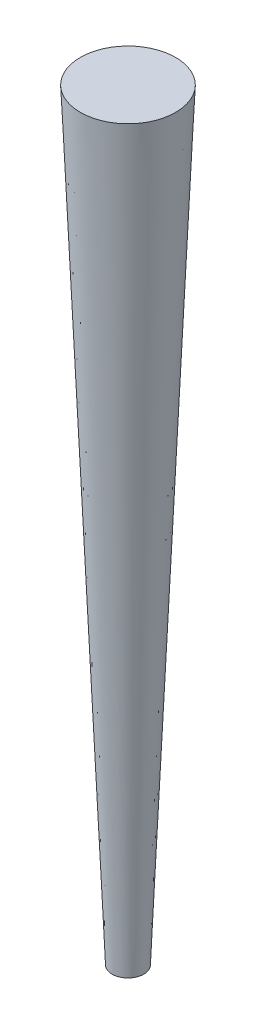
ISO-10303-21;
HEADER;
FILE_DESCRIPTION(('STEP AP214'),'2;1');
FILE_NAME('part.step','',(''),(''),'','','');
FILE_SCHEMA(('AUTOMOTIVE_DESIGN { 1 0 10303 214 1 1 1 1 }'));
ENDSEC;
DATA;
#1=APPLICATION_CONTEXT('core data for automotive mechanical design processes');
#2=APPLICATION_PROTOCOL_DEFINITION('international standard','automotive_design',2000,#1);
#3=PRODUCT_CONTEXT('',#1,'mechanical');
#4=PRODUCT('Part','Part','',(#3));
#5=PRODUCT_RELATED_PRODUCT_CATEGORY('part','',(#4));
#6=PRODUCT_DEFINITION_FORMATION('','',#4);
#7=PRODUCT_DEFINITION_CONTEXT('part definition',#1,'design');
#8=PRODUCT_DEFINITION('design','',#6,#7);
#9=PRODUCT_DEFINITION_SHAPE('','',#8);
#10=(LENGTH_UNIT() NAMED_UNIT(*) SI_UNIT(.MILLI.,.METRE.));
#11=(NAMED_UNIT(*) PLANE_ANGLE_UNIT() SI_UNIT($,.RADIAN.));
#12=(NAMED_UNIT(*) SI_UNIT($,.STERADIAN.) SOLID_ANGLE_UNIT());
#13=UNCERTAINTY_MEASURE_WITH_UNIT(LENGTH_MEASURE(1.E-05),#10,'distance_accuracy_value','');
#14=(GEOMETRIC_REPRESENTATION_CONTEXT(3) GLOBAL_UNCERTAINTY_ASSIGNED_CONTEXT((#13)) GLOBAL_UNIT_ASSIGNED_CONTEXT((#10,
#11,#12)) REPRESENTATION_CONTEXT('',''));
#15=CARTESIAN_POINT('',(0.,0.,0.));
#16=DIRECTION('',(0.,0.,1.));
#17=DIRECTION('',(1.,0.,0.));
#18=AXIS2_PLACEMENT_3D('',#15,#16,#17);
#19=CARTESIAN_POINT('',(0.,0.,0.));
#20=DIRECTION('',(0.,1.,0.));
#21=DIRECTION('',(0.,0.,1.));
#22=AXIS2_PLACEMENT_3D('',#19,#20,#21);
#23=PLANE('',#22);
#24=CARTESIAN_POINT('',(0.,0.,0.));
#25=DIRECTION('',(0.,1.,0.));
#26=DIRECTION('',(0.,0.,1.));
#27=AXIS2_PLACEMENT_3D('',#24,#25,#26);
#28=CIRCLE('',#27,12.7);
#29=CARTESIAN_POINT('',(0.,0.,12.7));
#30=VERTEX_POINT('',#29);
#31=EDGE_CURVE('E10',#30,#30,#28,.T.);
#32=ORIENTED_EDGE('',*,*,#31,.F.);
#33=EDGE_LOOP('',(#32));
#34=FACE_BOUND('',#33,.T.);
#35=ADVANCED_FACE('F36',(#34),#23,.F.);
#36=CARTESIAN_POINT('',(0.,0.,0.));
#37=DIRECTION('',(0.,1.,0.));
#38=DIRECTION('',(0.,0.,1.));
#39=AXIS2_PLACEMENT_3D('',#36,#37,#38);
#40=CONICAL_SURFACE('',#39,12.7,0.0416425790985884);
#41=CARTESIAN_POINT('',(0.,609.6,0.));
#42=DIRECTION('',(0.,1.,0.));
#43=DIRECTION('',(0.,0.,1.));
#44=AXIS2_PLACEMENT_3D('',#41,#42,#43);
#45=CIRCLE('',#44,38.1);
#46=CARTESIAN_POINT('',(0.,609.6,38.1));
#47=VERTEX_POINT('',#46);
#48=EDGE_CURVE('E42',#47,#47,#45,.T.);
#49=CARTESIAN_POINT('',(0.,609.6,38.1));
#50=CARTESIAN_POINT('',(0.,603.25,37.8354166666667));
#51=CARTESIAN_POINT('',(0.,596.9,37.5708333333333));
#52=CARTESIAN_POINT('',(0.,584.2,37.0416666666667));
#53=CARTESIAN_POINT('',(0.,577.85,36.7770833333333));
#54=CARTESIAN_POINT('',(0.,565.15,36.2479166666667));
#55=CARTESIAN_POINT('',(0.,558.8,35.9833333333333));
#56=CARTESIAN_POINT('',(0.,546.1,35.4541666666667));
#57=CARTESIAN_POINT('',(0.,539.75,35.1895833333333));
#58=CARTESIAN_POINT('',(0.,527.05,34.6604166666667));
#59=CARTESIAN_POINT('',(0.,520.7,34.3958333333333));
#60=CARTESIAN_POINT('',(0.,508.,33.8666666666667));
#61=CARTESIAN_POINT('',(0.,501.65,33.6020833333333));
#62=CARTESIAN_POINT('',(0.,488.95,33.0729166666667));
#63=CARTESIAN_POINT('',(0.,482.6,32.8083333333333));
#64=CARTESIAN_POINT('',(0.,469.9,32.2791666666667));
#65=CARTESIAN_POINT('',(0.,463.55,32.0145833333333));
#66=CARTESIAN_POINT('',(0.,450.85,31.4854166666667));
#67=CARTESIAN_POINT('',(0.,444.5,31.2208333333333));
#68=CARTESIAN_POINT('',(0.,431.8,30.6916666666667));
#69=CARTESIAN_POINT('',(0.,425.45,30.4270833333333));
#70=CARTESIAN_POINT('',(0.,412.75,29.8979166666667));
#71=CARTESIAN_POINT('',(0.,406.4,29.6333333333333));
#72=CARTESIAN_POINT('',(0.,393.7,29.1041666666667));
#73=CARTESIAN_POINT('',(0.,387.35,28.8395833333333));
#74=CARTESIAN_POINT('',(0.,374.65,28.3104166666667));
#75=CARTESIAN_POINT('',(0.,368.3,28.0458333333333));
#76=CARTESIAN_POINT('',(0.,355.6,27.5166666666667));
#77=CARTESIAN_POINT('',(0.,349.25,27.2520833333333));
#78=CARTESIAN_POINT('',(0.,336.55,26.7229166666667));
#79=CARTESIAN_POINT('',(0.,330.2,26.4583333333333));
#80=CARTESIAN_POINT('',(0.,317.5,25.9291666666667));
#81=CARTESIAN_POINT('',(0.,311.15,25.6645833333333));
#82=CARTESIAN_POINT('',(0.,298.45,25.1354166666667));
#83=CARTESIAN_POINT('',(0.,292.1,24.8708333333333));
#84=CARTESIAN_POINT('',(0.,279.4,24.3416666666667));
#85=CARTESIAN_POINT('',(0.,273.05,24.0770833333333));
#86=CARTESIAN_POINT('',(0.,260.35,23.5479166666667));
#87=CARTESIAN_POINT('',(0.,254.,23.2833333333333));
#88=CARTESIAN_POINT('',(0.,241.3,22.7541666666667));
#89=CARTESIAN_POINT('',(0.,234.95,22.4895833333333));
#90=CARTESIAN_POINT('',(0.,222.25,21.9604166666667));
#91=CARTESIAN_POINT('',(0.,215.9,21.6958333333333));
#92=CARTESIAN_POINT('',(0.,203.2,21.1666666666667));
#93=CARTESIAN_POINT('',(0.,196.85,20.9020833333333));
#94=CARTESIAN_POINT('',(0.,184.15,20.3729166666667));
#95=CARTESIAN_POINT('',(0.,177.8,20.1083333333333));
#96=CARTESIAN_POINT('',(0.,165.1,19.5791666666667));
#97=CARTESIAN_POINT('',(0.,158.75,19.3145833333333));
#98=CARTESIAN_POINT('',(0.,146.05,18.7854166666667));
#99=CARTESIAN_POINT('',(0.,139.7,18.5208333333333));
#100=CARTESIAN_POINT('',(0.,127.,17.9916666666667));
#101=CARTESIAN_POINT('',(0.,120.65,17.7270833333333));
#102=CARTESIAN_POINT('',(0.,107.95,17.1979166666667));
#103=CARTESIAN_POINT('',(0.,101.6,16.9333333333333));
#104=CARTESIAN_POINT('',(0.,88.9,16.4041666666667));
#105=CARTESIAN_POINT('',(0.,82.55,16.1395833333333));
#106=CARTESIAN_POINT('',(0.,69.85,15.6104166666667));
#107=CARTESIAN_POINT('',(0.,63.5,15.3458333333333));
#108=CARTESIAN_POINT('',(0.,50.8,14.8166666666667));
#109=CARTESIAN_POINT('',(0.,44.45,14.5520833333333));
#110=CARTESIAN_POINT('',(0.,31.75,14.0229166666667));
#111=CARTESIAN_POINT('',(0.,25.4,13.7583333333333));
#112=CARTESIAN_POINT('',(0.,12.7,13.2291666666667));
#113=CARTESIAN_POINT('',(0.,6.35,12.9645833333333));
#114=CARTESIAN_POINT('',(0.,0.,12.7));
#115=B_SPLINE_CURVE_WITH_KNOTS('',3,(#49,#50,#51,#52,#53,#54,#55,#56,#57,#58,#59,#60,#61,#62,
#63,#64,#65,#66,#67,#68,#69,#70,#71,#72,#73,#74,#75,#76,#77,#78,#79,#80,#81,#82,#83,#84,#85,#86,
#87,#88,#89,#90,#91,#92,#93,#94,#95,#96,#97,#98,#99,#100,#101,#102,#103,#104,#105,#106,#107,
#108,#109,#110,#111,#112,#113,#114),.UNSPECIFIED.,.F.,.F.,(4,2,2,2,2,2,2,2,2,2,2,2,2,2,2,2,2,2,
2,2,2,2,2,2,2,2,2,2,2,2,2,2,4),(0.,19.0665292872746,38.1330585745492,57.1995878618238,
76.2661171490984,95.3326464363729,114.399175723648,133.465705010922,152.532234298197,
171.598763585471,190.665292872746,209.731822160021,228.798351447295,247.86488073457,
266.931410021844,285.997939309119,305.064468596394,324.130997883668,343.197527170943,
362.264056458217,381.330585745492,400.397115032766,419.463644320041,438.530173607316,
457.59670289459,476.663232181865,495.729761469139,514.796290756414,533.862820043688,
552.929349330963,571.995878618238,591.062407905512,610.128937192787),.UNSPECIFIED.);
#116=EDGE_CURVE('BSEAM50',#47,#30,#115,.T.);
#117=ORIENTED_EDGE('',*,*,#48,.F.);
#118=ORIENTED_EDGE('',*,*,#31,.T.);
#119=ORIENTED_EDGE('',*,*,#116,.T.);
#120=ORIENTED_EDGE('',*,*,#116,.F.);
#121=EDGE_LOOP('',(#117,#119,#118,#120));
#122=FACE_BOUND('',#121,.T.);
#123=ADVANCED_FACE('F50',(#122),#40,.T.);
#124=CARTESIAN_POINT('',(0.,609.6,0.));
#125=DIRECTION('',(0.,-1.,0.));
#126=DIRECTION('',(0.,0.,-1.));
#127=AXIS2_PLACEMENT_3D('',#124,#125,#126);
#128=PLANE('',#127);
#129=ORIENTED_EDGE('',*,*,#48,.T.);
#130=EDGE_LOOP('',(#129));
#131=FACE_BOUND('',#130,.T.);
#132=ADVANCED_FACE('F48',(#131),#128,.F.);
#133=CLOSED_SHELL('',(#35,#123,#132));
#134=MANIFOLD_SOLID_BREP('B2',#133);
#135=ADVANCED_BREP_SHAPE_REPRESENTATION('',(#18,#134),#14);
#136=SHAPE_DEFINITION_REPRESENTATION(#9,#135);
ENDSEC;
END-ISO-10303-21;
